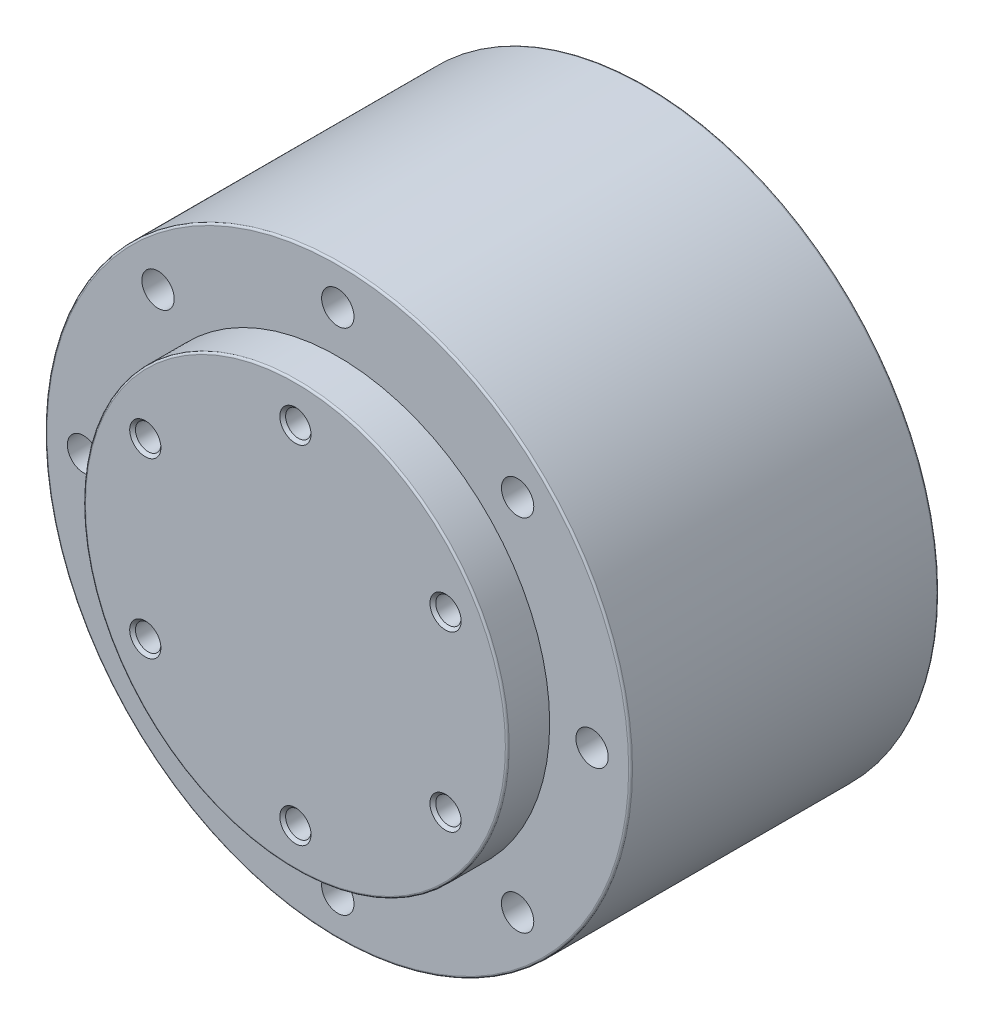
ISO-10303-21;
HEADER;
FILE_DESCRIPTION(('STEP AP214'),'2;1');
FILE_NAME('part.step','',(''),(''),'','','');
FILE_SCHEMA(('AUTOMOTIVE_DESIGN { 1 0 10303 214 1 1 1 1 }'));
ENDSEC;
DATA;
#1=APPLICATION_CONTEXT('core data for automotive mechanical design processes');
#2=APPLICATION_PROTOCOL_DEFINITION('international standard','automotive_design',2000,#1);
#3=PRODUCT_CONTEXT('',#1,'mechanical');
#4=PRODUCT('Part','Part','',(#3));
#5=PRODUCT_RELATED_PRODUCT_CATEGORY('part','',(#4));
#6=PRODUCT_DEFINITION_FORMATION('','',#4);
#7=PRODUCT_DEFINITION_CONTEXT('part definition',#1,'design');
#8=PRODUCT_DEFINITION('design','',#6,#7);
#9=PRODUCT_DEFINITION_SHAPE('','',#8);
#10=(LENGTH_UNIT() NAMED_UNIT(*) SI_UNIT(.MILLI.,.METRE.));
#11=(NAMED_UNIT(*) PLANE_ANGLE_UNIT() SI_UNIT($,.RADIAN.));
#12=(NAMED_UNIT(*) SI_UNIT($,.STERADIAN.) SOLID_ANGLE_UNIT());
#13=UNCERTAINTY_MEASURE_WITH_UNIT(LENGTH_MEASURE(1.E-05),#10,'distance_accuracy_value','');
#14=(GEOMETRIC_REPRESENTATION_CONTEXT(3) GLOBAL_UNCERTAINTY_ASSIGNED_CONTEXT((#13)) GLOBAL_UNIT_ASSIGNED_CONTEXT((#10,
#11,#12)) REPRESENTATION_CONTEXT('',''));
#15=CARTESIAN_POINT('',(0.,0.,0.));
#16=DIRECTION('',(0.,0.,1.));
#17=DIRECTION('',(1.,0.,0.));
#18=AXIS2_PLACEMENT_3D('',#15,#16,#17);
#19=CARTESIAN_POINT('',(0.,0.,-20.));
#20=DIRECTION('',(0.,0.,1.));
#21=DIRECTION('',(1.,0.,0.));
#22=AXIS2_PLACEMENT_3D('',#19,#20,#21);
#23=PLANE('',#22);
#24=CARTESIAN_POINT('',(0.,0.,-20.));
#25=DIRECTION('',(0.,0.,1.));
#26=DIRECTION('',(1.,0.,0.));
#27=AXIS2_PLACEMENT_3D('',#24,#25,#26);
#28=CIRCLE('',#27,37.75);
#29=CARTESIAN_POINT('',(37.75,0.,-20.));
#30=VERTEX_POINT('',#29);
#31=EDGE_CURVE('E11',#30,#30,#28,.F.);
#32=ORIENTED_EDGE('',*,*,#31,.T.);
#33=EDGE_LOOP('',(#32));
#34=FACE_BOUND('',#33,.T.);
#35=CARTESIAN_POINT('',(-23.3345237791561,23.3345237791561,-20.));
#36=DIRECTION('',(0.,0.,-1.));
#37=DIRECTION('',(-1.,0.,0.));
#38=AXIS2_PLACEMENT_3D('',#35,#36,#37);
#39=CIRCLE('',#38,2.525);
#40=CARTESIAN_POINT('',(-25.8595237791561,23.3345237791561,-20.));
#41=VERTEX_POINT('',#40);
#42=EDGE_CURVE('E141',#41,#41,#39,.T.);
#43=ORIENTED_EDGE('',*,*,#42,.F.);
#44=EDGE_LOOP('',(#43));
#45=FACE_BOUND('',#44,.T.);
#46=CARTESIAN_POINT('',(23.3345237791561,-23.3345237791561,-20.));
#47=DIRECTION('',(0.,0.,-1.));
#48=DIRECTION('',(-1.,0.,0.));
#49=AXIS2_PLACEMENT_3D('',#46,#47,#48);
#50=CIRCLE('',#49,2.525);
#51=CARTESIAN_POINT('',(20.8095237791561,-23.3345237791561,-20.));
#52=VERTEX_POINT('',#51);
#53=EDGE_CURVE('E177',#52,#52,#50,.T.);
#54=ORIENTED_EDGE('',*,*,#53,.F.);
#55=EDGE_LOOP('',(#54));
#56=FACE_BOUND('',#55,.T.);
#57=CARTESIAN_POINT('',(33.,0.,-20.));
#58=DIRECTION('',(0.,0.,-1.));
#59=DIRECTION('',(-1.,0.,0.));
#60=AXIS2_PLACEMENT_3D('',#57,#58,#59);
#61=CIRCLE('',#60,2.525);
#62=CARTESIAN_POINT('',(30.475,0.,-20.));
#63=VERTEX_POINT('',#62);
#64=EDGE_CURVE('E186',#63,#63,#61,.T.);
#65=ORIENTED_EDGE('',*,*,#64,.F.);
#66=EDGE_LOOP('',(#65));
#67=FACE_BOUND('',#66,.T.);
#68=CARTESIAN_POINT('',(23.3345237791561,23.3345237791561,-20.));
#69=DIRECTION('',(0.,0.,-1.));
#70=DIRECTION('',(-1.,0.,0.));
#71=AXIS2_PLACEMENT_3D('',#68,#69,#70);
#72=CIRCLE('',#71,2.525);
#73=CARTESIAN_POINT('',(20.8095237791561,23.3345237791561,-20.));
#74=VERTEX_POINT('',#73);
#75=EDGE_CURVE('E195',#74,#74,#72,.T.);
#76=ORIENTED_EDGE('',*,*,#75,.F.);
#77=EDGE_LOOP('',(#76));
#78=FACE_BOUND('',#77,.T.);
#79=CARTESIAN_POINT('',(0.,-33.,-20.));
#80=DIRECTION('',(0.,0.,-1.));
#81=DIRECTION('',(-1.,0.,0.));
#82=AXIS2_PLACEMENT_3D('',#79,#80,#81);
#83=CIRCLE('',#82,2.525);
#84=CARTESIAN_POINT('',(-2.525,-33.,-20.));
#85=VERTEX_POINT('',#84);
#86=EDGE_CURVE('E168',#85,#85,#83,.T.);
#87=ORIENTED_EDGE('',*,*,#86,.F.);
#88=EDGE_LOOP('',(#87));
#89=FACE_BOUND('',#88,.T.);
#90=CARTESIAN_POINT('',(-23.3345237791561,-23.3345237791561,-20.));
#91=DIRECTION('',(0.,0.,-1.));
#92=DIRECTION('',(-1.,0.,0.));
#93=AXIS2_PLACEMENT_3D('',#90,#91,#92);
#94=CIRCLE('',#93,2.525);
#95=CARTESIAN_POINT('',(-25.8595237791561,-23.3345237791561,-20.));
#96=VERTEX_POINT('',#95);
#97=EDGE_CURVE('E159',#96,#96,#94,.T.);
#98=ORIENTED_EDGE('',*,*,#97,.F.);
#99=EDGE_LOOP('',(#98));
#100=FACE_BOUND('',#99,.T.);
#101=CARTESIAN_POINT('',(-33.,0.,-20.));
#102=DIRECTION('',(0.,0.,-1.));
#103=DIRECTION('',(-1.,0.,0.));
#104=AXIS2_PLACEMENT_3D('',#101,#102,#103);
#105=CIRCLE('',#104,2.525);
#106=CARTESIAN_POINT('',(-35.525,0.,-20.));
#107=VERTEX_POINT('',#106);
#108=EDGE_CURVE('E150',#107,#107,#105,.T.);
#109=ORIENTED_EDGE('',*,*,#108,.F.);
#110=EDGE_LOOP('',(#109));
#111=FACE_BOUND('',#110,.T.);
#112=CARTESIAN_POINT('',(0.,33.,-20.));
#113=DIRECTION('',(0.,0.,-1.));
#114=DIRECTION('',(-1.,0.,0.));
#115=AXIS2_PLACEMENT_3D('',#112,#113,#114);
#116=CIRCLE('',#115,2.525);
#117=CARTESIAN_POINT('',(-2.525,33.,-20.));
#118=VERTEX_POINT('',#117);
#119=EDGE_CURVE('E132',#118,#118,#116,.T.);
#120=ORIENTED_EDGE('',*,*,#119,.F.);
#121=EDGE_LOOP('',(#120));
#122=FACE_BOUND('',#121,.T.);
#123=ADVANCED_FACE('F43',(#34,#45,#56,#67,#78,#89,#100,#111,#122),#23,.F.);
#124=CARTESIAN_POINT('',(0.,0.,20.));
#125=DIRECTION('',(0.,0.,-1.));
#126=DIRECTION('',(-1.,0.,0.));
#127=AXIS2_PLACEMENT_3D('',#124,#125,#126);
#128=CYLINDRICAL_SURFACE('',#127,38.);
#129=CARTESIAN_POINT('',(0.,0.,19.75));
#130=DIRECTION('',(0.,0.,1.));
#131=DIRECTION('',(1.,0.,0.));
#132=AXIS2_PLACEMENT_3D('',#129,#130,#131);
#133=CIRCLE('',#132,38.);
#134=CARTESIAN_POINT('',(38.,0.,19.75));
#135=VERTEX_POINT('',#134);
#136=EDGE_CURVE('E51',#135,#135,#133,.F.);
#137=ORIENTED_EDGE('',*,*,#136,.T.);
#138=EDGE_LOOP('',(#137));
#139=FACE_BOUND('',#138,.T.);
#140=CARTESIAN_POINT('',(0.,0.,-19.75));
#141=DIRECTION('',(0.,0.,1.));
#142=DIRECTION('',(1.,0.,0.));
#143=AXIS2_PLACEMENT_3D('',#140,#141,#142);
#144=CIRCLE('',#143,38.);
#145=CARTESIAN_POINT('',(38.,0.,-19.75));
#146=VERTEX_POINT('',#145);
#147=EDGE_CURVE('E216',#146,#146,#144,.T.);
#148=ORIENTED_EDGE('',*,*,#147,.T.);
#149=EDGE_LOOP('',(#148));
#150=FACE_BOUND('',#149,.T.);
#151=ADVANCED_FACE('F221',(#139,#150),#128,.T.);
#152=CARTESIAN_POINT('',(0.,0.,20.));
#153=DIRECTION('',(0.,0.,1.));
#154=DIRECTION('',(1.,0.,0.));
#155=AXIS2_PLACEMENT_3D('',#152,#153,#154);
#156=PLANE('',#155);
#157=CARTESIAN_POINT('',(0.,0.,20.));
#158=DIRECTION('',(0.,0.,1.));
#159=DIRECTION('',(1.,0.,0.));
#160=AXIS2_PLACEMENT_3D('',#157,#158,#159);
#161=CIRCLE('',#160,37.75);
#162=CARTESIAN_POINT('',(37.75,0.,20.));
#163=VERTEX_POINT('',#162);
#164=EDGE_CURVE('E213',#163,#163,#161,.T.);
#165=ORIENTED_EDGE('',*,*,#164,.T.);
#166=EDGE_LOOP('',(#165));
#167=FACE_BOUND('',#166,.T.);
#168=CARTESIAN_POINT('',(0.,33.,20.));
#169=DIRECTION('',(0.,0.,1.));
#170=DIRECTION('',(1.,0.,0.));
#171=AXIS2_PLACEMENT_3D('',#168,#169,#170);
#172=CIRCLE('',#171,2.09999999999999);
#173=CARTESIAN_POINT('',(2.09999999999999,33.,20.));
#174=VERTEX_POINT('',#173);
#175=EDGE_CURVE('E138',#174,#174,#172,.T.);
#176=ORIENTED_EDGE('',*,*,#175,.F.);
#177=EDGE_LOOP('',(#176));
#178=FACE_BOUND('',#177,.T.);
#179=CARTESIAN_POINT('',(-23.3345237791561,23.3345237791561,20.));
#180=DIRECTION('',(0.,0.,1.));
#181=DIRECTION('',(1.,0.,0.));
#182=AXIS2_PLACEMENT_3D('',#179,#180,#181);
#183=CIRCLE('',#182,2.09999999999999);
#184=CARTESIAN_POINT('',(-21.2345237791561,23.3345237791561,20.));
#185=VERTEX_POINT('',#184);
#186=EDGE_CURVE('E147',#185,#185,#183,.T.);
#187=ORIENTED_EDGE('',*,*,#186,.F.);
#188=EDGE_LOOP('',(#187));
#189=FACE_BOUND('',#188,.T.);
#190=CARTESIAN_POINT('',(-33.,0.,20.));
#191=DIRECTION('',(0.,0.,1.));
#192=DIRECTION('',(1.,0.,0.));
#193=AXIS2_PLACEMENT_3D('',#190,#191,#192);
#194=CIRCLE('',#193,2.09999999999999);
#195=CARTESIAN_POINT('',(-30.9,0.,20.));
#196=VERTEX_POINT('',#195);
#197=EDGE_CURVE('E156',#196,#196,#194,.T.);
#198=ORIENTED_EDGE('',*,*,#197,.F.);
#199=EDGE_LOOP('',(#198));
#200=FACE_BOUND('',#199,.T.);
#201=CARTESIAN_POINT('',(-23.3345237791561,-23.3345237791561,20.));
#202=DIRECTION('',(0.,0.,1.));
#203=DIRECTION('',(1.,0.,0.));
#204=AXIS2_PLACEMENT_3D('',#201,#202,#203);
#205=CIRCLE('',#204,2.09999999999999);
#206=CARTESIAN_POINT('',(-21.2345237791561,-23.3345237791561,20.));
#207=VERTEX_POINT('',#206);
#208=EDGE_CURVE('E165',#207,#207,#205,.T.);
#209=ORIENTED_EDGE('',*,*,#208,.F.);
#210=EDGE_LOOP('',(#209));
#211=FACE_BOUND('',#210,.T.);
#212=CARTESIAN_POINT('',(0.,-33.,20.));
#213=DIRECTION('',(0.,0.,1.));
#214=DIRECTION('',(1.,0.,0.));
#215=AXIS2_PLACEMENT_3D('',#212,#213,#214);
#216=CIRCLE('',#215,2.09999999999999);
#217=CARTESIAN_POINT('',(2.09999999999999,-33.,20.));
#218=VERTEX_POINT('',#217);
#219=EDGE_CURVE('E174',#218,#218,#216,.T.);
#220=ORIENTED_EDGE('',*,*,#219,.F.);
#221=EDGE_LOOP('',(#220));
#222=FACE_BOUND('',#221,.T.);
#223=CARTESIAN_POINT('',(23.3345237791561,-23.3345237791561,20.));
#224=DIRECTION('',(0.,0.,1.));
#225=DIRECTION('',(1.,0.,0.));
#226=AXIS2_PLACEMENT_3D('',#223,#224,#225);
#227=CIRCLE('',#226,2.09999999999999);
#228=CARTESIAN_POINT('',(25.4345237791561,-23.3345237791561,20.));
#229=VERTEX_POINT('',#228);
#230=EDGE_CURVE('E183',#229,#229,#227,.T.);
#231=ORIENTED_EDGE('',*,*,#230,.F.);
#232=EDGE_LOOP('',(#231));
#233=FACE_BOUND('',#232,.T.);
#234=CARTESIAN_POINT('',(33.,0.,20.));
#235=DIRECTION('',(0.,0.,1.));
#236=DIRECTION('',(1.,0.,0.));
#237=AXIS2_PLACEMENT_3D('',#234,#235,#236);
#238=CIRCLE('',#237,2.09999999999999);
#239=CARTESIAN_POINT('',(35.1,0.,20.));
#240=VERTEX_POINT('',#239);
#241=EDGE_CURVE('E192',#240,#240,#238,.T.);
#242=ORIENTED_EDGE('',*,*,#241,.F.);
#243=EDGE_LOOP('',(#242));
#244=FACE_BOUND('',#243,.T.);
#245=CARTESIAN_POINT('',(23.3345237791561,23.3345237791561,20.));
#246=DIRECTION('',(0.,0.,1.));
#247=DIRECTION('',(1.,0.,0.));
#248=AXIS2_PLACEMENT_3D('',#245,#246,#247);
#249=CIRCLE('',#248,2.09999999999999);
#250=CARTESIAN_POINT('',(25.4345237791561,23.3345237791561,20.));
#251=VERTEX_POINT('',#250);
#252=EDGE_CURVE('E201',#251,#251,#249,.T.);
#253=ORIENTED_EDGE('',*,*,#252,.F.);
#254=EDGE_LOOP('',(#253));
#255=FACE_BOUND('',#254,.T.);
#256=CARTESIAN_POINT('',(0.,0.,20.));
#257=DIRECTION('',(0.,0.,1.));
#258=DIRECTION('',(1.,0.,0.));
#259=AXIS2_PLACEMENT_3D('',#256,#257,#258);
#260=CIRCLE('',#259,27.5);
#261=CARTESIAN_POINT('',(27.5,0.,20.));
#262=VERTEX_POINT('',#261);
#263=EDGE_CURVE('E204',#262,#262,#260,.T.);
#264=ORIENTED_EDGE('',*,*,#263,.F.);
#265=EDGE_LOOP('',(#264));
#266=FACE_BOUND('',#265,.T.);
#267=ADVANCED_FACE('F230',(#167,#178,#189,#200,#211,#222,#233,#244,#255,#266),#156,.T.);
#268=CARTESIAN_POINT('',(0.,0.,25.5));
#269=DIRECTION('',(0.,0.,-1.));
#270=DIRECTION('',(-1.,0.,0.));
#271=AXIS2_PLACEMENT_3D('',#268,#269,#270);
#272=CYLINDRICAL_SURFACE('',#271,27.5);
#273=CARTESIAN_POINT('',(0.,0.,25.25));
#274=DIRECTION('',(0.,0.,1.));
#275=DIRECTION('',(1.,0.,0.));
#276=AXIS2_PLACEMENT_3D('',#273,#274,#275);
#277=CIRCLE('',#276,27.5);
#278=CARTESIAN_POINT('',(27.5,0.,25.25));
#279=VERTEX_POINT('',#278);
#280=EDGE_CURVE('E210',#279,#279,#277,.F.);
#281=ORIENTED_EDGE('',*,*,#280,.T.);
#282=EDGE_LOOP('',(#281));
#283=FACE_BOUND('',#282,.T.);
#284=ORIENTED_EDGE('',*,*,#263,.T.);
#285=EDGE_LOOP('',(#284));
#286=FACE_BOUND('',#285,.T.);
#287=ADVANCED_FACE('F233',(#283,#286),#272,.T.);
#288=CARTESIAN_POINT('',(0.,0.,25.5));
#289=DIRECTION('',(0.,0.,1.));
#290=DIRECTION('',(1.,0.,0.));
#291=AXIS2_PLACEMENT_3D('',#288,#289,#290);
#292=PLANE('',#291);
#293=CARTESIAN_POINT('',(0.,0.,25.5));
#294=DIRECTION('',(0.,0.,1.));
#295=DIRECTION('',(1.,0.,0.));
#296=AXIS2_PLACEMENT_3D('',#293,#294,#295);
#297=CIRCLE('',#296,27.25);
#298=CARTESIAN_POINT('',(27.25,0.,25.5));
#299=VERTEX_POINT('',#298);
#300=EDGE_CURVE('E207',#299,#299,#297,.T.);
#301=ORIENTED_EDGE('',*,*,#300,.T.);
#302=EDGE_LOOP('',(#301));
#303=FACE_BOUND('',#302,.T.);
#304=CARTESIAN_POINT('',(0.,22.5,25.5));
#305=DIRECTION('',(0.,0.,1.));
#306=DIRECTION('',(1.,0.,0.));
#307=AXIS2_PLACEMENT_3D('',#304,#305,#306);
#308=CIRCLE('',#307,2.025);
#309=CARTESIAN_POINT('',(2.025,22.5,25.5));
#310=VERTEX_POINT('',#309);
#311=EDGE_CURVE('E87',#310,#310,#308,.T.);
#312=ORIENTED_EDGE('',*,*,#311,.F.);
#313=EDGE_LOOP('',(#312));
#314=FACE_BOUND('',#313,.T.);
#315=CARTESIAN_POINT('',(19.4855715851499,11.25,25.5));
#316=DIRECTION('',(0.,0.,1.));
#317=DIRECTION('',(1.,0.,0.));
#318=AXIS2_PLACEMENT_3D('',#315,#316,#317);
#319=CIRCLE('',#318,2.025);
#320=CARTESIAN_POINT('',(21.5105715851499,11.25,25.5));
#321=VERTEX_POINT('',#320);
#322=EDGE_CURVE('E80',#321,#321,#319,.T.);
#323=ORIENTED_EDGE('',*,*,#322,.F.);
#324=EDGE_LOOP('',(#323));
#325=FACE_BOUND('',#324,.T.);
#326=CARTESIAN_POINT('',(19.4855715851499,-11.25,25.5));
#327=DIRECTION('',(0.,0.,1.));
#328=DIRECTION('',(1.,0.,0.));
#329=AXIS2_PLACEMENT_3D('',#326,#327,#328);
#330=CIRCLE('',#329,2.025);
#331=CARTESIAN_POINT('',(21.5105715851499,-11.25,25.5));
#332=VERTEX_POINT('',#331);
#333=EDGE_CURVE('E96',#332,#332,#330,.T.);
#334=ORIENTED_EDGE('',*,*,#333,.F.);
#335=EDGE_LOOP('',(#334));
#336=FACE_BOUND('',#335,.T.);
#337=CARTESIAN_POINT('',(0.,-22.5,25.5));
#338=DIRECTION('',(0.,0.,1.));
#339=DIRECTION('',(1.,0.,0.));
#340=AXIS2_PLACEMENT_3D('',#337,#338,#339);
#341=CIRCLE('',#340,2.025);
#342=CARTESIAN_POINT('',(2.025,-22.5,25.5));
#343=VERTEX_POINT('',#342);
#344=EDGE_CURVE('E105',#343,#343,#341,.T.);
#345=ORIENTED_EDGE('',*,*,#344,.F.);
#346=EDGE_LOOP('',(#345));
#347=FACE_BOUND('',#346,.T.);
#348=CARTESIAN_POINT('',(-19.4855715851499,-11.25,25.5));
#349=DIRECTION('',(0.,0.,1.));
#350=DIRECTION('',(1.,0.,0.));
#351=AXIS2_PLACEMENT_3D('',#348,#349,#350);
#352=CIRCLE('',#351,2.025);
#353=CARTESIAN_POINT('',(-17.4605715851499,-11.25,25.5));
#354=VERTEX_POINT('',#353);
#355=EDGE_CURVE('E114',#354,#354,#352,.T.);
#356=ORIENTED_EDGE('',*,*,#355,.F.);
#357=EDGE_LOOP('',(#356));
#358=FACE_BOUND('',#357,.T.);
#359=CARTESIAN_POINT('',(-19.4855715851499,11.25,25.5));
#360=DIRECTION('',(0.,0.,1.));
#361=DIRECTION('',(1.,0.,0.));
#362=AXIS2_PLACEMENT_3D('',#359,#360,#361);
#363=CIRCLE('',#362,2.025);
#364=CARTESIAN_POINT('',(-17.4605715851499,11.25,25.5));
#365=VERTEX_POINT('',#364);
#366=EDGE_CURVE('E123',#365,#365,#363,.T.);
#367=ORIENTED_EDGE('',*,*,#366,.F.);
#368=EDGE_LOOP('',(#367));
#369=FACE_BOUND('',#368,.T.);
#370=ADVANCED_FACE('F254',(#303,#314,#325,#336,#347,#358,#369),#292,.T.);
#371=CARTESIAN_POINT('',(23.3345237791561,23.3345237791561,-20.));
#372=DIRECTION('',(0.,0.,-1.));
#373=DIRECTION('',(-1.,0.,0.));
#374=AXIS2_PLACEMENT_3D('',#371,#372,#373);
#375=CYLINDRICAL_SURFACE('',#374,2.09999999999999);
#376=CARTESIAN_POINT('',(23.3345237791561,23.3345237791561,-19.575));
#377=DIRECTION('',(0.,0.,-1.));
#378=DIRECTION('',(-1.,0.,0.));
#379=AXIS2_PLACEMENT_3D('',#376,#377,#378);
#380=CIRCLE('',#379,2.1);
#381=CARTESIAN_POINT('',(21.2345237791561,23.3345237791561,-19.575));
#382=VERTEX_POINT('',#381);
#383=EDGE_CURVE('E198',#382,#382,#380,.T.);
#384=ORIENTED_EDGE('',*,*,#383,.T.);
#385=EDGE_LOOP('',(#384));
#386=FACE_BOUND('',#385,.T.);
#387=ORIENTED_EDGE('',*,*,#252,.T.);
#388=EDGE_LOOP('',(#387));
#389=FACE_BOUND('',#388,.T.);
#390=ADVANCED_FACE('F260',(#386,#389),#375,.F.);
#391=CARTESIAN_POINT('',(23.3345237791561,23.3345237791561,-20.));
#392=DIRECTION('',(0.,0.,-1.));
#393=DIRECTION('',(-1.,0.,0.));
#394=AXIS2_PLACEMENT_3D('',#391,#392,#393);
#395=CONICAL_SURFACE('',#394,2.525,0.78539816339744);
#396=ORIENTED_EDGE('',*,*,#383,.F.);
#397=EDGE_LOOP('',(#396));
#398=FACE_BOUND('',#397,.T.);
#399=ORIENTED_EDGE('',*,*,#75,.T.);
#400=EDGE_LOOP('',(#399));
#401=FACE_BOUND('',#400,.T.);
#402=ADVANCED_FACE('F372',(#398,#401),#395,.F.);
#403=CARTESIAN_POINT('',(33.,0.,-20.));
#404=DIRECTION('',(0.,0.,-1.));
#405=DIRECTION('',(-1.,0.,0.));
#406=AXIS2_PLACEMENT_3D('',#403,#404,#405);
#407=CYLINDRICAL_SURFACE('',#406,2.09999999999999);
#408=CARTESIAN_POINT('',(33.,0.,-19.575));
#409=DIRECTION('',(0.,0.,-1.));
#410=DIRECTION('',(-1.,0.,0.));
#411=AXIS2_PLACEMENT_3D('',#408,#409,#410);
#412=CIRCLE('',#411,2.1);
#413=CARTESIAN_POINT('',(30.9,0.,-19.575));
#414=VERTEX_POINT('',#413);
#415=EDGE_CURVE('E189',#414,#414,#412,.T.);
#416=ORIENTED_EDGE('',*,*,#415,.T.);
#417=EDGE_LOOP('',(#416));
#418=FACE_BOUND('',#417,.T.);
#419=ORIENTED_EDGE('',*,*,#241,.T.);
#420=EDGE_LOOP('',(#419));
#421=FACE_BOUND('',#420,.T.);
#422=ADVANCED_FACE('F368',(#418,#421),#407,.F.);
#423=CARTESIAN_POINT('',(33.,0.,-20.));
#424=DIRECTION('',(0.,0.,-1.));
#425=DIRECTION('',(-1.,0.,0.));
#426=AXIS2_PLACEMENT_3D('',#423,#424,#425);
#427=CONICAL_SURFACE('',#426,2.525,0.78539816339744);
#428=ORIENTED_EDGE('',*,*,#415,.F.);
#429=EDGE_LOOP('',(#428));
#430=FACE_BOUND('',#429,.T.);
#431=ORIENTED_EDGE('',*,*,#64,.T.);
#432=EDGE_LOOP('',(#431));
#433=FACE_BOUND('',#432,.T.);
#434=ADVANCED_FACE('F364',(#430,#433),#427,.F.);
#435=CARTESIAN_POINT('',(23.3345237791561,-23.3345237791561,-20.));
#436=DIRECTION('',(0.,0.,-1.));
#437=DIRECTION('',(-1.,0.,0.));
#438=AXIS2_PLACEMENT_3D('',#435,#436,#437);
#439=CYLINDRICAL_SURFACE('',#438,2.09999999999999);
#440=CARTESIAN_POINT('',(23.3345237791561,-23.3345237791561,-19.575));
#441=DIRECTION('',(0.,0.,-1.));
#442=DIRECTION('',(-1.,0.,0.));
#443=AXIS2_PLACEMENT_3D('',#440,#441,#442);
#444=CIRCLE('',#443,2.1);
#445=CARTESIAN_POINT('',(21.2345237791561,-23.3345237791561,-19.575));
#446=VERTEX_POINT('',#445);
#447=EDGE_CURVE('E180',#446,#446,#444,.T.);
#448=ORIENTED_EDGE('',*,*,#447,.T.);
#449=EDGE_LOOP('',(#448));
#450=FACE_BOUND('',#449,.T.);
#451=ORIENTED_EDGE('',*,*,#230,.T.);
#452=EDGE_LOOP('',(#451));
#453=FACE_BOUND('',#452,.T.);
#454=ADVANCED_FACE('F360',(#450,#453),#439,.F.);
#455=CARTESIAN_POINT('',(23.3345237791561,-23.3345237791561,-20.));
#456=DIRECTION('',(0.,0.,-1.));
#457=DIRECTION('',(-1.,0.,0.));
#458=AXIS2_PLACEMENT_3D('',#455,#456,#457);
#459=CONICAL_SURFACE('',#458,2.525,0.78539816339744);
#460=ORIENTED_EDGE('',*,*,#447,.F.);
#461=EDGE_LOOP('',(#460));
#462=FACE_BOUND('',#461,.T.);
#463=ORIENTED_EDGE('',*,*,#53,.T.);
#464=EDGE_LOOP('',(#463));
#465=FACE_BOUND('',#464,.T.);
#466=ADVANCED_FACE('F356',(#462,#465),#459,.F.);
#467=CARTESIAN_POINT('',(0.,-33.,-20.));
#468=DIRECTION('',(0.,0.,-1.));
#469=DIRECTION('',(-1.,0.,0.));
#470=AXIS2_PLACEMENT_3D('',#467,#468,#469);
#471=CYLINDRICAL_SURFACE('',#470,2.09999999999999);
#472=CARTESIAN_POINT('',(0.,-33.,-19.575));
#473=DIRECTION('',(0.,0.,-1.));
#474=DIRECTION('',(-1.,0.,0.));
#475=AXIS2_PLACEMENT_3D('',#472,#473,#474);
#476=CIRCLE('',#475,2.1);
#477=CARTESIAN_POINT('',(-2.1,-33.,-19.575));
#478=VERTEX_POINT('',#477);
#479=EDGE_CURVE('E171',#478,#478,#476,.T.);
#480=ORIENTED_EDGE('',*,*,#479,.T.);
#481=EDGE_LOOP('',(#480));
#482=FACE_BOUND('',#481,.T.);
#483=ORIENTED_EDGE('',*,*,#219,.T.);
#484=EDGE_LOOP('',(#483));
#485=FACE_BOUND('',#484,.T.);
#486=ADVANCED_FACE('F352',(#482,#485),#471,.F.);
#487=CARTESIAN_POINT('',(0.,-33.,-20.));
#488=DIRECTION('',(0.,0.,-1.));
#489=DIRECTION('',(-1.,0.,0.));
#490=AXIS2_PLACEMENT_3D('',#487,#488,#489);
#491=CONICAL_SURFACE('',#490,2.525,0.785398163397439);
#492=ORIENTED_EDGE('',*,*,#479,.F.);
#493=EDGE_LOOP('',(#492));
#494=FACE_BOUND('',#493,.T.);
#495=ORIENTED_EDGE('',*,*,#86,.T.);
#496=EDGE_LOOP('',(#495));
#497=FACE_BOUND('',#496,.T.);
#498=ADVANCED_FACE('F348',(#494,#497),#491,.F.);
#499=CARTESIAN_POINT('',(-23.3345237791561,-23.3345237791561,-20.));
#500=DIRECTION('',(0.,0.,-1.));
#501=DIRECTION('',(-1.,0.,0.));
#502=AXIS2_PLACEMENT_3D('',#499,#500,#501);
#503=CYLINDRICAL_SURFACE('',#502,2.09999999999999);
#504=CARTESIAN_POINT('',(-23.3345237791561,-23.3345237791561,-19.575));
#505=DIRECTION('',(0.,0.,-1.));
#506=DIRECTION('',(-1.,0.,0.));
#507=AXIS2_PLACEMENT_3D('',#504,#505,#506);
#508=CIRCLE('',#507,2.1);
#509=CARTESIAN_POINT('',(-25.4345237791561,-23.3345237791561,-19.575));
#510=VERTEX_POINT('',#509);
#511=EDGE_CURVE('E162',#510,#510,#508,.T.);
#512=ORIENTED_EDGE('',*,*,#511,.T.);
#513=EDGE_LOOP('',(#512));
#514=FACE_BOUND('',#513,.T.);
#515=ORIENTED_EDGE('',*,*,#208,.T.);
#516=EDGE_LOOP('',(#515));
#517=FACE_BOUND('',#516,.T.);
#518=ADVANCED_FACE('F344',(#514,#517),#503,.F.);
#519=CARTESIAN_POINT('',(-23.3345237791561,-23.3345237791561,-20.));
#520=DIRECTION('',(0.,0.,-1.));
#521=DIRECTION('',(-1.,0.,0.));
#522=AXIS2_PLACEMENT_3D('',#519,#520,#521);
#523=CONICAL_SURFACE('',#522,2.525,0.78539816339744);
#524=ORIENTED_EDGE('',*,*,#511,.F.);
#525=EDGE_LOOP('',(#524));
#526=FACE_BOUND('',#525,.T.);
#527=ORIENTED_EDGE('',*,*,#97,.T.);
#528=EDGE_LOOP('',(#527));
#529=FACE_BOUND('',#528,.T.);
#530=ADVANCED_FACE('F340',(#526,#529),#523,.F.);
#531=CARTESIAN_POINT('',(-33.,0.,-20.));
#532=DIRECTION('',(0.,0.,-1.));
#533=DIRECTION('',(-1.,0.,0.));
#534=AXIS2_PLACEMENT_3D('',#531,#532,#533);
#535=CYLINDRICAL_SURFACE('',#534,2.09999999999999);
#536=CARTESIAN_POINT('',(-33.,0.,-19.575));
#537=DIRECTION('',(0.,0.,-1.));
#538=DIRECTION('',(-1.,0.,0.));
#539=AXIS2_PLACEMENT_3D('',#536,#537,#538);
#540=CIRCLE('',#539,2.1);
#541=CARTESIAN_POINT('',(-35.1,0.,-19.575));
#542=VERTEX_POINT('',#541);
#543=EDGE_CURVE('E153',#542,#542,#540,.T.);
#544=ORIENTED_EDGE('',*,*,#543,.T.);
#545=EDGE_LOOP('',(#544));
#546=FACE_BOUND('',#545,.T.);
#547=ORIENTED_EDGE('',*,*,#197,.T.);
#548=EDGE_LOOP('',(#547));
#549=FACE_BOUND('',#548,.T.);
#550=ADVANCED_FACE('F336',(#546,#549),#535,.F.);
#551=CARTESIAN_POINT('',(-33.,0.,-20.));
#552=DIRECTION('',(0.,0.,-1.));
#553=DIRECTION('',(-1.,0.,0.));
#554=AXIS2_PLACEMENT_3D('',#551,#552,#553);
#555=CONICAL_SURFACE('',#554,2.525,0.78539816339744);
#556=ORIENTED_EDGE('',*,*,#543,.F.);
#557=EDGE_LOOP('',(#556));
#558=FACE_BOUND('',#557,.T.);
#559=ORIENTED_EDGE('',*,*,#108,.T.);
#560=EDGE_LOOP('',(#559));
#561=FACE_BOUND('',#560,.T.);
#562=ADVANCED_FACE('F332',(#558,#561),#555,.F.);
#563=CARTESIAN_POINT('',(-23.3345237791561,23.3345237791561,-20.));
#564=DIRECTION('',(0.,0.,-1.));
#565=DIRECTION('',(-1.,0.,0.));
#566=AXIS2_PLACEMENT_3D('',#563,#564,#565);
#567=CYLINDRICAL_SURFACE('',#566,2.09999999999999);
#568=CARTESIAN_POINT('',(-23.3345237791561,23.3345237791561,-19.575));
#569=DIRECTION('',(0.,0.,-1.));
#570=DIRECTION('',(-1.,0.,0.));
#571=AXIS2_PLACEMENT_3D('',#568,#569,#570);
#572=CIRCLE('',#571,2.1);
#573=CARTESIAN_POINT('',(-25.4345237791561,23.3345237791561,-19.575));
#574=VERTEX_POINT('',#573);
#575=EDGE_CURVE('E144',#574,#574,#572,.T.);
#576=ORIENTED_EDGE('',*,*,#575,.T.);
#577=EDGE_LOOP('',(#576));
#578=FACE_BOUND('',#577,.T.);
#579=ORIENTED_EDGE('',*,*,#186,.T.);
#580=EDGE_LOOP('',(#579));
#581=FACE_BOUND('',#580,.T.);
#582=ADVANCED_FACE('F328',(#578,#581),#567,.F.);
#583=CARTESIAN_POINT('',(-23.3345237791561,23.3345237791561,-20.));
#584=DIRECTION('',(0.,0.,-1.));
#585=DIRECTION('',(-1.,0.,0.));
#586=AXIS2_PLACEMENT_3D('',#583,#584,#585);
#587=CONICAL_SURFACE('',#586,2.525,0.78539816339744);
#588=ORIENTED_EDGE('',*,*,#575,.F.);
#589=EDGE_LOOP('',(#588));
#590=FACE_BOUND('',#589,.T.);
#591=ORIENTED_EDGE('',*,*,#42,.T.);
#592=EDGE_LOOP('',(#591));
#593=FACE_BOUND('',#592,.T.);
#594=ADVANCED_FACE('F324',(#590,#593),#587,.F.);
#595=CARTESIAN_POINT('',(0.,33.,-20.));
#596=DIRECTION('',(0.,0.,-1.));
#597=DIRECTION('',(-1.,0.,0.));
#598=AXIS2_PLACEMENT_3D('',#595,#596,#597);
#599=CYLINDRICAL_SURFACE('',#598,2.09999999999999);
#600=CARTESIAN_POINT('',(0.,33.,-19.575));
#601=DIRECTION('',(0.,0.,-1.));
#602=DIRECTION('',(-1.,0.,0.));
#603=AXIS2_PLACEMENT_3D('',#600,#601,#602);
#604=CIRCLE('',#603,2.1);
#605=CARTESIAN_POINT('',(-2.1,33.,-19.575));
#606=VERTEX_POINT('',#605);
#607=EDGE_CURVE('E135',#606,#606,#604,.T.);
#608=ORIENTED_EDGE('',*,*,#607,.T.);
#609=EDGE_LOOP('',(#608));
#610=FACE_BOUND('',#609,.T.);
#611=ORIENTED_EDGE('',*,*,#175,.T.);
#612=EDGE_LOOP('',(#611));
#613=FACE_BOUND('',#612,.T.);
#614=ADVANCED_FACE('F320',(#610,#613),#599,.F.);
#615=CARTESIAN_POINT('',(0.,33.,-20.));
#616=DIRECTION('',(0.,0.,-1.));
#617=DIRECTION('',(-1.,0.,0.));
#618=AXIS2_PLACEMENT_3D('',#615,#616,#617);
#619=CONICAL_SURFACE('',#618,2.525,0.785398163397439);
#620=ORIENTED_EDGE('',*,*,#607,.F.);
#621=EDGE_LOOP('',(#620));
#622=FACE_BOUND('',#621,.T.);
#623=ORIENTED_EDGE('',*,*,#119,.T.);
#624=EDGE_LOOP('',(#623));
#625=FACE_BOUND('',#624,.T.);
#626=ADVANCED_FACE('F317',(#622,#625),#619,.F.);
#627=CARTESIAN_POINT('',(-19.4855715851499,11.25,15.4));
#628=DIRECTION('',(0.,0.,1.));
#629=DIRECTION('',(1.,0.,0.));
#630=AXIS2_PLACEMENT_3D('',#627,#628,#629);
#631=CONICAL_SURFACE('',#630,1.65,1.02974425867665);
#632=CARTESIAN_POINT('',(-19.4855715851499,11.25,14.4085799786045));
#633=VERTEX_POINT('',#632);
#634=VERTEX_LOOP('',#633);
#635=FACE_BOUND('',#634,.T.);
#636=CARTESIAN_POINT('',(-19.4855715851499,11.25,15.4));
#637=DIRECTION('',(0.,0.,1.));
#638=DIRECTION('',(1.,0.,0.));
#639=AXIS2_PLACEMENT_3D('',#636,#637,#638);
#640=CIRCLE('',#639,1.65);
#641=CARTESIAN_POINT('',(-17.8355715851499,11.25,15.4));
#642=VERTEX_POINT('',#641);
#643=EDGE_CURVE('E129',#642,#642,#640,.T.);
#644=ORIENTED_EDGE('',*,*,#643,.T.);
#645=EDGE_LOOP('',(#644));
#646=FACE_BOUND('',#645,.T.);
#647=ADVANCED_FACE('F309',(#635,#646),#631,.F.);
#648=CARTESIAN_POINT('',(-19.4855715851499,11.25,25.5));
#649=DIRECTION('',(0.,0.,1.));
#650=DIRECTION('',(1.,0.,0.));
#651=AXIS2_PLACEMENT_3D('',#648,#649,#650);
#652=CYLINDRICAL_SURFACE('',#651,1.65);
#653=ORIENTED_EDGE('',*,*,#643,.F.);
#654=EDGE_LOOP('',(#653));
#655=FACE_BOUND('',#654,.T.);
#656=CARTESIAN_POINT('',(-19.4855715851499,11.25,25.125));
#657=DIRECTION('',(0.,0.,1.));
#658=DIRECTION('',(1.,0.,0.));
#659=AXIS2_PLACEMENT_3D('',#656,#657,#658);
#660=CIRCLE('',#659,1.65);
#661=CARTESIAN_POINT('',(-17.8355715851499,11.25,25.125));
#662=VERTEX_POINT('',#661);
#663=EDGE_CURVE('E126',#662,#662,#660,.T.);
#664=ORIENTED_EDGE('',*,*,#663,.T.);
#665=EDGE_LOOP('',(#664));
#666=FACE_BOUND('',#665,.T.);
#667=ADVANCED_FACE('F300',(#655,#666),#652,.F.);
#668=CARTESIAN_POINT('',(-19.4855715851499,11.25,25.5));
#669=DIRECTION('',(0.,0.,1.));
#670=DIRECTION('',(1.,0.,0.));
#671=AXIS2_PLACEMENT_3D('',#668,#669,#670);
#672=CONICAL_SURFACE('',#671,2.025,0.785398163397448);
#673=ORIENTED_EDGE('',*,*,#663,.F.);
#674=EDGE_LOOP('',(#673));
#675=FACE_BOUND('',#674,.T.);
#676=ORIENTED_EDGE('',*,*,#366,.T.);
#677=EDGE_LOOP('',(#676));
#678=FACE_BOUND('',#677,.T.);
#679=ADVANCED_FACE('F297',(#675,#678),#672,.F.);
#680=CARTESIAN_POINT('',(-19.4855715851499,-11.25,15.4));
#681=DIRECTION('',(0.,0.,1.));
#682=DIRECTION('',(1.,0.,0.));
#683=AXIS2_PLACEMENT_3D('',#680,#681,#682);
#684=CONICAL_SURFACE('',#683,1.65,1.02974425867665);
#685=CARTESIAN_POINT('',(-19.4855715851499,-11.25,14.4085799786045));
#686=VERTEX_POINT('',#685);
#687=VERTEX_LOOP('',#686);
#688=FACE_BOUND('',#687,.T.);
#689=CARTESIAN_POINT('',(-19.4855715851499,-11.25,15.4));
#690=DIRECTION('',(0.,0.,1.));
#691=DIRECTION('',(1.,0.,0.));
#692=AXIS2_PLACEMENT_3D('',#689,#690,#691);
#693=CIRCLE('',#692,1.65);
#694=CARTESIAN_POINT('',(-17.8355715851499,-11.25,15.4));
#695=VERTEX_POINT('',#694);
#696=EDGE_CURVE('E120',#695,#695,#693,.T.);
#697=ORIENTED_EDGE('',*,*,#696,.T.);
#698=EDGE_LOOP('',(#697));
#699=FACE_BOUND('',#698,.T.);
#700=ADVANCED_FACE('F299',(#688,#699),#684,.F.);
#701=CARTESIAN_POINT('',(-19.4855715851499,-11.25,25.5));
#702=DIRECTION('',(0.,0.,1.));
#703=DIRECTION('',(1.,0.,0.));
#704=AXIS2_PLACEMENT_3D('',#701,#702,#703);
#705=CYLINDRICAL_SURFACE('',#704,1.65);
#706=ORIENTED_EDGE('',*,*,#696,.F.);
#707=EDGE_LOOP('',(#706));
#708=FACE_BOUND('',#707,.T.);
#709=CARTESIAN_POINT('',(-19.4855715851499,-11.25,25.125));
#710=DIRECTION('',(0.,0.,1.));
#711=DIRECTION('',(1.,0.,0.));
#712=AXIS2_PLACEMENT_3D('',#709,#710,#711);
#713=CIRCLE('',#712,1.65);
#714=CARTESIAN_POINT('',(-17.8355715851499,-11.25,25.125));
#715=VERTEX_POINT('',#714);
#716=EDGE_CURVE('E117',#715,#715,#713,.T.);
#717=ORIENTED_EDGE('',*,*,#716,.T.);
#718=EDGE_LOOP('',(#717));
#719=FACE_BOUND('',#718,.T.);
#720=ADVANCED_FACE('F307',(#708,#719),#705,.F.);
#721=CARTESIAN_POINT('',(-19.4855715851499,-11.25,25.5));
#722=DIRECTION('',(0.,0.,1.));
#723=DIRECTION('',(1.,0.,0.));
#724=AXIS2_PLACEMENT_3D('',#721,#722,#723);
#725=CONICAL_SURFACE('',#724,2.025,0.785398163397448);
#726=ORIENTED_EDGE('',*,*,#716,.F.);
#727=EDGE_LOOP('',(#726));
#728=FACE_BOUND('',#727,.T.);
#729=ORIENTED_EDGE('',*,*,#355,.T.);
#730=EDGE_LOOP('',(#729));
#731=FACE_BOUND('',#730,.T.);
#732=ADVANCED_FACE('F479',(#728,#731),#725,.F.);
#733=CARTESIAN_POINT('',(0.,-22.5,15.4));
#734=DIRECTION('',(0.,0.,1.));
#735=DIRECTION('',(1.,0.,0.));
#736=AXIS2_PLACEMENT_3D('',#733,#734,#735);
#737=CONICAL_SURFACE('',#736,1.65,1.02974425867665);
#738=CARTESIAN_POINT('',(0.,-22.5,14.4085799786045));
#739=VERTEX_POINT('',#738);
#740=VERTEX_LOOP('',#739);
#741=FACE_BOUND('',#740,.T.);
#742=CARTESIAN_POINT('',(0.,-22.5,15.4));
#743=DIRECTION('',(0.,0.,1.));
#744=DIRECTION('',(1.,0.,0.));
#745=AXIS2_PLACEMENT_3D('',#742,#743,#744);
#746=CIRCLE('',#745,1.65);
#747=CARTESIAN_POINT('',(1.65,-22.5,15.4));
#748=VERTEX_POINT('',#747);
#749=EDGE_CURVE('E111',#748,#748,#746,.T.);
#750=ORIENTED_EDGE('',*,*,#749,.T.);
#751=EDGE_LOOP('',(#750));
#752=FACE_BOUND('',#751,.T.);
#753=ADVANCED_FACE('F491',(#741,#752),#737,.F.);
#754=CARTESIAN_POINT('',(0.,-22.5,25.5));
#755=DIRECTION('',(0.,0.,1.));
#756=DIRECTION('',(1.,0.,0.));
#757=AXIS2_PLACEMENT_3D('',#754,#755,#756);
#758=CYLINDRICAL_SURFACE('',#757,1.65);
#759=ORIENTED_EDGE('',*,*,#749,.F.);
#760=EDGE_LOOP('',(#759));
#761=FACE_BOUND('',#760,.T.);
#762=CARTESIAN_POINT('',(0.,-22.5,25.125));
#763=DIRECTION('',(0.,0.,1.));
#764=DIRECTION('',(1.,0.,0.));
#765=AXIS2_PLACEMENT_3D('',#762,#763,#764);
#766=CIRCLE('',#765,1.65);
#767=CARTESIAN_POINT('',(1.65,-22.5,25.125));
#768=VERTEX_POINT('',#767);
#769=EDGE_CURVE('E108',#768,#768,#766,.T.);
#770=ORIENTED_EDGE('',*,*,#769,.T.);
#771=EDGE_LOOP('',(#770));
#772=FACE_BOUND('',#771,.T.);
#773=ADVANCED_FACE('F486',(#761,#772),#758,.F.);
#774=CARTESIAN_POINT('',(0.,-22.5,25.5));
#775=DIRECTION('',(0.,0.,1.));
#776=DIRECTION('',(1.,0.,0.));
#777=AXIS2_PLACEMENT_3D('',#774,#775,#776);
#778=CONICAL_SURFACE('',#777,2.025,0.78539816339745);
#779=ORIENTED_EDGE('',*,*,#769,.F.);
#780=EDGE_LOOP('',(#779));
#781=FACE_BOUND('',#780,.T.);
#782=ORIENTED_EDGE('',*,*,#344,.T.);
#783=EDGE_LOOP('',(#782));
#784=FACE_BOUND('',#783,.T.);
#785=ADVANCED_FACE('F490',(#781,#784),#778,.F.);
#786=CARTESIAN_POINT('',(19.4855715851499,-11.25,15.4));
#787=DIRECTION('',(0.,0.,1.));
#788=DIRECTION('',(1.,0.,0.));
#789=AXIS2_PLACEMENT_3D('',#786,#787,#788);
#790=CONICAL_SURFACE('',#789,1.65,1.02974425867665);
#791=CARTESIAN_POINT('',(19.4855715851499,-11.25,14.4085799786045));
#792=VERTEX_POINT('',#791);
#793=VERTEX_LOOP('',#792);
#794=FACE_BOUND('',#793,.T.);
#795=CARTESIAN_POINT('',(19.4855715851499,-11.25,15.4));
#796=DIRECTION('',(0.,0.,1.));
#797=DIRECTION('',(1.,0.,0.));
#798=AXIS2_PLACEMENT_3D('',#795,#796,#797);
#799=CIRCLE('',#798,1.65);
#800=CARTESIAN_POINT('',(21.1355715851499,-11.25,15.4));
#801=VERTEX_POINT('',#800);
#802=EDGE_CURVE('E102',#801,#801,#799,.T.);
#803=ORIENTED_EDGE('',*,*,#802,.T.);
#804=EDGE_LOOP('',(#803));
#805=FACE_BOUND('',#804,.T.);
#806=ADVANCED_FACE('F505',(#794,#805),#790,.F.);
#807=CARTESIAN_POINT('',(19.4855715851499,-11.25,25.5));
#808=DIRECTION('',(0.,0.,1.));
#809=DIRECTION('',(1.,0.,0.));
#810=AXIS2_PLACEMENT_3D('',#807,#808,#809);
#811=CYLINDRICAL_SURFACE('',#810,1.65);
#812=ORIENTED_EDGE('',*,*,#802,.F.);
#813=EDGE_LOOP('',(#812));
#814=FACE_BOUND('',#813,.T.);
#815=CARTESIAN_POINT('',(19.4855715851499,-11.25,25.125));
#816=DIRECTION('',(0.,0.,1.));
#817=DIRECTION('',(1.,0.,0.));
#818=AXIS2_PLACEMENT_3D('',#815,#816,#817);
#819=CIRCLE('',#818,1.65);
#820=CARTESIAN_POINT('',(21.1355715851499,-11.25,25.125));
#821=VERTEX_POINT('',#820);
#822=EDGE_CURVE('E99',#821,#821,#819,.T.);
#823=ORIENTED_EDGE('',*,*,#822,.T.);
#824=EDGE_LOOP('',(#823));
#825=FACE_BOUND('',#824,.T.);
#826=ADVANCED_FACE('F500',(#814,#825),#811,.F.);
#827=CARTESIAN_POINT('',(19.4855715851499,-11.25,25.5));
#828=DIRECTION('',(0.,0.,1.));
#829=DIRECTION('',(1.,0.,0.));
#830=AXIS2_PLACEMENT_3D('',#827,#828,#829);
#831=CONICAL_SURFACE('',#830,2.025,0.785398163397448);
#832=ORIENTED_EDGE('',*,*,#822,.F.);
#833=EDGE_LOOP('',(#832));
#834=FACE_BOUND('',#833,.T.);
#835=ORIENTED_EDGE('',*,*,#333,.T.);
#836=EDGE_LOOP('',(#835));
#837=FACE_BOUND('',#836,.T.);
#838=ADVANCED_FACE('F504',(#834,#837),#831,.F.);
#839=CARTESIAN_POINT('',(19.4855715851499,11.25,15.4));
#840=DIRECTION('',(0.,0.,1.));
#841=DIRECTION('',(1.,0.,0.));
#842=AXIS2_PLACEMENT_3D('',#839,#840,#841);
#843=CONICAL_SURFACE('',#842,1.65,1.02974425867665);
#844=CARTESIAN_POINT('',(19.4855715851499,11.25,14.4085799786045));
#845=VERTEX_POINT('',#844);
#846=VERTEX_LOOP('',#845);
#847=FACE_BOUND('',#846,.T.);
#848=CARTESIAN_POINT('',(19.4855715851499,11.25,15.4));
#849=DIRECTION('',(0.,0.,1.));
#850=DIRECTION('',(1.,0.,0.));
#851=AXIS2_PLACEMENT_3D('',#848,#849,#850);
#852=CIRCLE('',#851,1.65);
#853=CARTESIAN_POINT('',(21.1355715851499,11.25,15.4));
#854=VERTEX_POINT('',#853);
#855=EDGE_CURVE('E93',#854,#854,#852,.T.);
#856=ORIENTED_EDGE('',*,*,#855,.T.);
#857=EDGE_LOOP('',(#856));
#858=FACE_BOUND('',#857,.T.);
#859=ADVANCED_FACE('F518',(#847,#858),#843,.F.);
#860=CARTESIAN_POINT('',(19.4855715851499,11.25,25.5));
#861=DIRECTION('',(0.,0.,1.));
#862=DIRECTION('',(1.,0.,0.));
#863=AXIS2_PLACEMENT_3D('',#860,#861,#862);
#864=CYLINDRICAL_SURFACE('',#863,1.65);
#865=ORIENTED_EDGE('',*,*,#855,.F.);
#866=EDGE_LOOP('',(#865));
#867=FACE_BOUND('',#866,.T.);
#868=CARTESIAN_POINT('',(19.4855715851499,11.25,25.125));
#869=DIRECTION('',(0.,0.,1.));
#870=DIRECTION('',(1.,0.,0.));
#871=AXIS2_PLACEMENT_3D('',#868,#869,#870);
#872=CIRCLE('',#871,1.65);
#873=CARTESIAN_POINT('',(21.1355715851499,11.25,25.125));
#874=VERTEX_POINT('',#873);
#875=EDGE_CURVE('E84',#874,#874,#872,.T.);
#876=ORIENTED_EDGE('',*,*,#875,.T.);
#877=EDGE_LOOP('',(#876));
#878=FACE_BOUND('',#877,.T.);
#879=ADVANCED_FACE('F514',(#867,#878),#864,.F.);
#880=CARTESIAN_POINT('',(19.4855715851499,11.25,25.5));
#881=DIRECTION('',(0.,0.,1.));
#882=DIRECTION('',(1.,0.,0.));
#883=AXIS2_PLACEMENT_3D('',#880,#881,#882);
#884=CONICAL_SURFACE('',#883,2.025,0.785398163397448);
#885=ORIENTED_EDGE('',*,*,#875,.F.);
#886=EDGE_LOOP('',(#885));
#887=FACE_BOUND('',#886,.T.);
#888=ORIENTED_EDGE('',*,*,#322,.T.);
#889=EDGE_LOOP('',(#888));
#890=FACE_BOUND('',#889,.T.);
#891=ADVANCED_FACE('F74',(#887,#890),#884,.F.);
#892=CARTESIAN_POINT('',(0.,22.5,15.4));
#893=DIRECTION('',(0.,0.,1.));
#894=DIRECTION('',(1.,0.,0.));
#895=AXIS2_PLACEMENT_3D('',#892,#893,#894);
#896=CONICAL_SURFACE('',#895,1.65,1.02974425867665);
#897=CARTESIAN_POINT('',(0.,22.5,14.4085799786045));
#898=VERTEX_POINT('',#897);
#899=VERTEX_LOOP('',#898);
#900=FACE_BOUND('',#899,.T.);
#901=CARTESIAN_POINT('',(0.,22.5,15.4));
#902=DIRECTION('',(0.,0.,1.));
#903=DIRECTION('',(1.,0.,0.));
#904=AXIS2_PLACEMENT_3D('',#901,#902,#903);
#905=CIRCLE('',#904,1.65);
#906=CARTESIAN_POINT('',(1.65,22.5,15.4));
#907=VERTEX_POINT('',#906);
#908=EDGE_CURVE('E78',#907,#907,#905,.T.);
#909=ORIENTED_EDGE('',*,*,#908,.T.);
#910=EDGE_LOOP('',(#909));
#911=FACE_BOUND('',#910,.T.);
#912=ADVANCED_FACE('F70',(#900,#911),#896,.F.);
#913=CARTESIAN_POINT('',(0.,22.5,25.5));
#914=DIRECTION('',(0.,0.,1.));
#915=DIRECTION('',(1.,0.,0.));
#916=AXIS2_PLACEMENT_3D('',#913,#914,#915);
#917=CYLINDRICAL_SURFACE('',#916,1.65);
#918=ORIENTED_EDGE('',*,*,#908,.F.);
#919=EDGE_LOOP('',(#918));
#920=FACE_BOUND('',#919,.T.);
#921=CARTESIAN_POINT('',(0.,22.5,25.125));
#922=DIRECTION('',(0.,0.,1.));
#923=DIRECTION('',(1.,0.,0.));
#924=AXIS2_PLACEMENT_3D('',#921,#922,#923);
#925=CIRCLE('',#924,1.65);
#926=CARTESIAN_POINT('',(1.65,22.5,25.125));
#927=VERTEX_POINT('',#926);
#928=EDGE_CURVE('E81',#927,#927,#925,.T.);
#929=ORIENTED_EDGE('',*,*,#928,.T.);
#930=EDGE_LOOP('',(#929));
#931=FACE_BOUND('',#930,.T.);
#932=ADVANCED_FACE('F73',(#920,#931),#917,.F.);
#933=CARTESIAN_POINT('',(0.,22.5,25.5));
#934=DIRECTION('',(0.,0.,1.));
#935=DIRECTION('',(1.,0.,0.));
#936=AXIS2_PLACEMENT_3D('',#933,#934,#935);
#937=CONICAL_SURFACE('',#936,2.025,0.78539816339745);
#938=ORIENTED_EDGE('',*,*,#928,.F.);
#939=EDGE_LOOP('',(#938));
#940=FACE_BOUND('',#939,.T.);
#941=ORIENTED_EDGE('',*,*,#311,.T.);
#942=EDGE_LOOP('',(#941));
#943=FACE_BOUND('',#942,.T.);
#944=ADVANCED_FACE('F273',(#940,#943),#937,.F.);
#945=CARTESIAN_POINT('',(0.,0.,25.25));
#946=DIRECTION('',(0.,0.,1.));
#947=DIRECTION('',(1.,0.,0.));
#948=AXIS2_PLACEMENT_3D('',#945,#946,#947);
#949=TOROIDAL_SURFACE('',#948,27.25,0.25);
#950=ORIENTED_EDGE('',*,*,#280,.F.);
#951=EDGE_LOOP('',(#950));
#952=FACE_BOUND('',#951,.T.);
#953=ORIENTED_EDGE('',*,*,#300,.F.);
#954=EDGE_LOOP('',(#953));
#955=FACE_BOUND('',#954,.T.);
#956=ADVANCED_FACE('F227',(#952,#955),#949,.T.);
#957=CARTESIAN_POINT('',(0.,0.,19.75));
#958=DIRECTION('',(0.,0.,1.));
#959=DIRECTION('',(1.,0.,0.));
#960=AXIS2_PLACEMENT_3D('',#957,#958,#959);
#961=TOROIDAL_SURFACE('',#960,37.75,0.25);
#962=ORIENTED_EDGE('',*,*,#136,.F.);
#963=EDGE_LOOP('',(#962));
#964=FACE_BOUND('',#963,.T.);
#965=ORIENTED_EDGE('',*,*,#164,.F.);
#966=EDGE_LOOP('',(#965));
#967=FACE_BOUND('',#966,.T.);
#968=ADVANCED_FACE('F224',(#964,#967),#961,.T.);
#969=CARTESIAN_POINT('',(0.,0.,-19.75));
#970=DIRECTION('',(0.,0.,1.));
#971=DIRECTION('',(1.,0.,0.));
#972=AXIS2_PLACEMENT_3D('',#969,#970,#971);
#973=TOROIDAL_SURFACE('',#972,37.75,0.25);
#974=ORIENTED_EDGE('',*,*,#31,.F.);
#975=EDGE_LOOP('',(#974));
#976=FACE_BOUND('',#975,.T.);
#977=ORIENTED_EDGE('',*,*,#147,.F.);
#978=EDGE_LOOP('',(#977));
#979=FACE_BOUND('',#978,.T.);
#980=ADVANCED_FACE('F45',(#976,#979),#973,.T.);
#981=CLOSED_SHELL('',(#123,#151,#267,#287,#370,#390,#402,#422,#434,#454,#466,#486,#498,#518,
#530,#550,#562,#582,#594,#614,#626,#647,#667,#679,#700,#720,#732,#753,#773,#785,#806,#826,#838,
#859,#879,#891,#912,#932,#944,#956,#968,#980));
#982=MANIFOLD_SOLID_BREP('B2',#981);
#983=ADVANCED_BREP_SHAPE_REPRESENTATION('',(#18,#982),#14);
#984=SHAPE_DEFINITION_REPRESENTATION(#9,#983);
ENDSEC;
END-ISO-10303-21;
